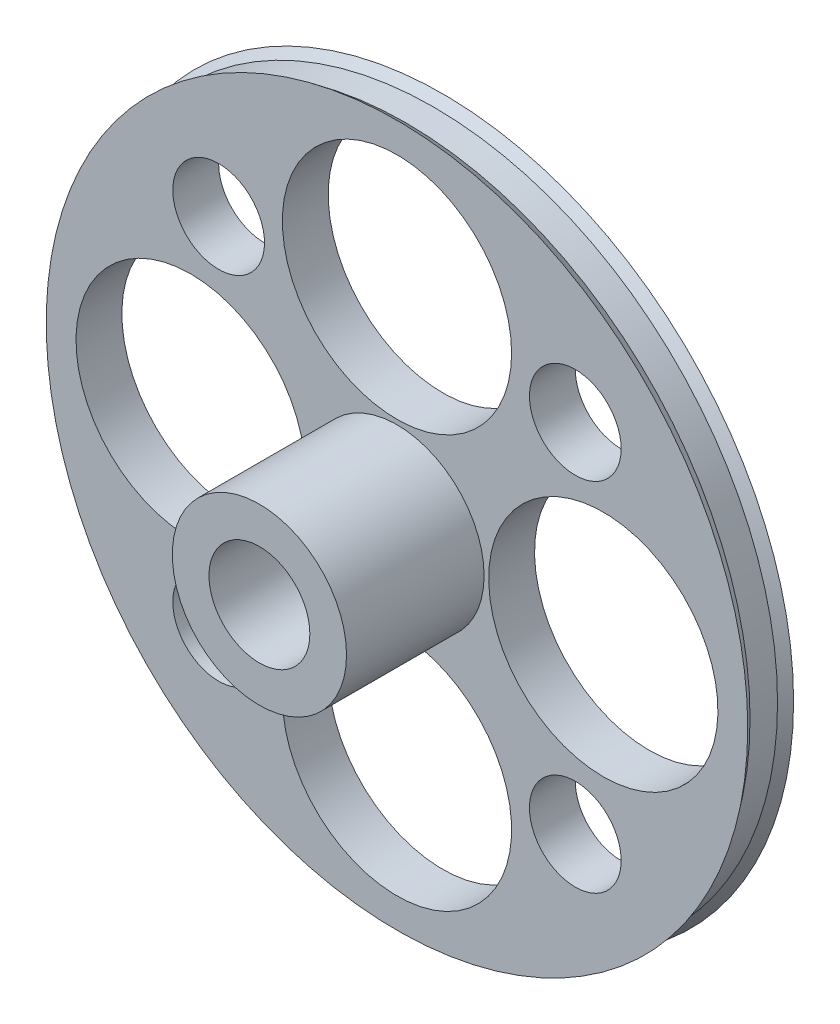
ISO-10303-21;
HEADER;
FILE_DESCRIPTION(('STEP AP214'),'2;1');
FILE_NAME('part.step','',(''),(''),'','','');
FILE_SCHEMA(('AUTOMOTIVE_DESIGN { 1 0 10303 214 1 1 1 1 }'));
ENDSEC;
DATA;
#1=APPLICATION_CONTEXT('core data for automotive mechanical design processes');
#2=APPLICATION_PROTOCOL_DEFINITION('international standard','automotive_design',2000,#1);
#3=PRODUCT_CONTEXT('',#1,'mechanical');
#4=PRODUCT('Part','Part','',(#3));
#5=PRODUCT_RELATED_PRODUCT_CATEGORY('part','',(#4));
#6=PRODUCT_DEFINITION_FORMATION('','',#4);
#7=PRODUCT_DEFINITION_CONTEXT('part definition',#1,'design');
#8=PRODUCT_DEFINITION('design','',#6,#7);
#9=PRODUCT_DEFINITION_SHAPE('','',#8);
#10=(LENGTH_UNIT() NAMED_UNIT(*) SI_UNIT(.MILLI.,.METRE.));
#11=(NAMED_UNIT(*) PLANE_ANGLE_UNIT() SI_UNIT($,.RADIAN.));
#12=(NAMED_UNIT(*) SI_UNIT($,.STERADIAN.) SOLID_ANGLE_UNIT());
#13=UNCERTAINTY_MEASURE_WITH_UNIT(LENGTH_MEASURE(1.E-05),#10,'distance_accuracy_value','');
#14=(GEOMETRIC_REPRESENTATION_CONTEXT(3) GLOBAL_UNCERTAINTY_ASSIGNED_CONTEXT((#13)) GLOBAL_UNIT_ASSIGNED_CONTEXT((#10,
#11,#12)) REPRESENTATION_CONTEXT('',''));
#15=CARTESIAN_POINT('',(0.,0.,0.));
#16=DIRECTION('',(0.,0.,1.));
#17=DIRECTION('',(1.,0.,0.));
#18=AXIS2_PLACEMENT_3D('',#15,#16,#17);
#19=CARTESIAN_POINT('',(0.,0.,10.));
#20=DIRECTION('',(0.,0.,1.));
#21=DIRECTION('',(1.,0.,0.));
#22=AXIS2_PLACEMENT_3D('',#19,#20,#21);
#23=PLANE('',#22);
#24=CARTESIAN_POINT('',(-38.8908729652596,38.8908729652606,10.));
#25=DIRECTION('',(0.,0.,1.));
#26=DIRECTION('',(0.,1.,0.));
#27=AXIS2_PLACEMENT_3D('',#24,#25,#26);
#28=CIRCLE('',#27,10.);
#29=CARTESIAN_POINT('',(-38.8908729652595,48.8908729652606,10.));
#30=VERTEX_POINT('',#29);
#31=EDGE_CURVE('E104',#30,#30,#28,.T.);
#32=ORIENTED_EDGE('',*,*,#31,.F.);
#33=EDGE_LOOP('',(#32));
#34=FACE_BOUND('',#33,.T.);
#35=CARTESIAN_POINT('',(-38.8908729652602,-38.8908729652601,10.));
#36=DIRECTION('',(0.,0.,1.));
#37=DIRECTION('',(-1.,0.,0.));
#38=AXIS2_PLACEMENT_3D('',#35,#36,#37);
#39=CIRCLE('',#38,10.);
#40=CARTESIAN_POINT('',(-48.8908729652602,-38.8908729652601,10.));
#41=VERTEX_POINT('',#40);
#42=EDGE_CURVE('E98',#41,#41,#39,.T.);
#43=ORIENTED_EDGE('',*,*,#42,.F.);
#44=EDGE_LOOP('',(#43));
#45=FACE_BOUND('',#44,.T.);
#46=CARTESIAN_POINT('',(38.8908729652599,-38.8908729652603,10.));
#47=DIRECTION('',(0.,0.,1.));
#48=DIRECTION('',(0.,-1.,0.));
#49=AXIS2_PLACEMENT_3D('',#46,#47,#48);
#50=CIRCLE('',#49,10.);
#51=CARTESIAN_POINT('',(38.8908729652599,-48.8908729652603,10.));
#52=VERTEX_POINT('',#51);
#53=EDGE_CURVE('E92',#52,#52,#50,.T.);
#54=ORIENTED_EDGE('',*,*,#53,.F.);
#55=EDGE_LOOP('',(#54));
#56=FACE_BOUND('',#55,.T.);
#57=CARTESIAN_POINT('',(38.8908729652602,38.8908729652601,10.));
#58=DIRECTION('',(0.,0.,1.));
#59=DIRECTION('',(1.,0.,0.));
#60=AXIS2_PLACEMENT_3D('',#57,#58,#59);
#61=CIRCLE('',#60,10.);
#62=CARTESIAN_POINT('',(48.8908729652602,38.8908729652601,10.));
#63=VERTEX_POINT('',#62);
#64=EDGE_CURVE('E86',#63,#63,#61,.T.);
#65=ORIENTED_EDGE('',*,*,#64,.F.);
#66=EDGE_LOOP('',(#65));
#67=FACE_BOUND('',#66,.T.);
#68=CARTESIAN_POINT('',(-45.,4.71349980743823E-13,10.));
#69=DIRECTION('',(0.,0.,1.));
#70=DIRECTION('',(0.,1.,0.));
#71=AXIS2_PLACEMENT_3D('',#68,#69,#70);
#72=CIRCLE('',#71,25.);
#73=CARTESIAN_POINT('',(-44.9999999999997,25.0000000000005,10.));
#74=VERTEX_POINT('',#73);
#75=EDGE_CURVE('E80',#74,#74,#72,.T.);
#76=ORIENTED_EDGE('',*,*,#75,.F.);
#77=EDGE_LOOP('',(#76));
#78=FACE_BOUND('',#77,.T.);
#79=CARTESIAN_POINT('',(0.,-45.,10.));
#80=DIRECTION('',(0.,0.,1.));
#81=DIRECTION('',(-1.,0.,0.));
#82=AXIS2_PLACEMENT_3D('',#79,#80,#81);
#83=CIRCLE('',#82,25.);
#84=CARTESIAN_POINT('',(-25.,-45.,10.));
#85=VERTEX_POINT('',#84);
#86=EDGE_CURVE('E74',#85,#85,#83,.T.);
#87=ORIENTED_EDGE('',*,*,#86,.F.);
#88=EDGE_LOOP('',(#87));
#89=FACE_BOUND('',#88,.T.);
#90=CARTESIAN_POINT('',(45.,-1.57116660247941E-13,10.));
#91=DIRECTION('',(0.,0.,1.));
#92=DIRECTION('',(0.,-1.,0.));
#93=AXIS2_PLACEMENT_3D('',#90,#91,#92);
#94=CIRCLE('',#93,25.);
#95=CARTESIAN_POINT('',(44.9999999999999,-25.0000000000002,10.));
#96=VERTEX_POINT('',#95);
#97=EDGE_CURVE('E68',#96,#96,#94,.T.);
#98=ORIENTED_EDGE('',*,*,#97,.F.);
#99=EDGE_LOOP('',(#98));
#100=FACE_BOUND('',#99,.T.);
#101=CARTESIAN_POINT('',(0.,45.,10.));
#102=DIRECTION('',(0.,0.,1.));
#103=DIRECTION('',(1.,0.,0.));
#104=AXIS2_PLACEMENT_3D('',#101,#102,#103);
#105=CIRCLE('',#104,25.);
#106=CARTESIAN_POINT('',(25.,45.,10.));
#107=VERTEX_POINT('',#106);
#108=EDGE_CURVE('E62',#107,#107,#105,.T.);
#109=ORIENTED_EDGE('',*,*,#108,.F.);
#110=EDGE_LOOP('',(#109));
#111=FACE_BOUND('',#110,.T.);
#112=CARTESIAN_POINT('',(0.,0.,10.));
#113=DIRECTION('',(0.,0.,1.));
#114=DIRECTION('',(1.,0.,0.));
#115=AXIS2_PLACEMENT_3D('',#112,#113,#114);
#116=CIRCLE('',#115,19.);
#117=CARTESIAN_POINT('',(19.,0.,10.));
#118=VERTEX_POINT('',#117);
#119=EDGE_CURVE('E35',#118,#118,#116,.T.);
#120=ORIENTED_EDGE('',*,*,#119,.F.);
#121=EDGE_LOOP('',(#120));
#122=FACE_BOUND('',#121,.T.);
#123=CARTESIAN_POINT('',(0.,0.,10.));
#124=DIRECTION('',(0.,0.,1.));
#125=DIRECTION('',(1.,0.,0.));
#126=AXIS2_PLACEMENT_3D('',#123,#124,#125);
#127=CIRCLE('',#126,76.5);
#128=CARTESIAN_POINT('',(76.5,0.,10.));
#129=VERTEX_POINT('',#128);
#130=EDGE_CURVE('E55',#129,#129,#127,.T.);
#131=ORIENTED_EDGE('',*,*,#130,.T.);
#132=EDGE_LOOP('',(#131));
#133=FACE_BOUND('',#132,.T.);
#134=ADVANCED_FACE('F31',(#34,#45,#56,#67,#78,#89,#100,#111,#122,#133),#23,.T.);
#135=CARTESIAN_POINT('',(0.,0.,10.));
#136=DIRECTION('',(0.,0.,-1.));
#137=DIRECTION('',(-1.,0.,0.));
#138=AXIS2_PLACEMENT_3D('',#135,#136,#137);
#139=CYLINDRICAL_SURFACE('',#138,75.);
#140=CARTESIAN_POINT('',(0.,0.,8.));
#141=DIRECTION('',(0.,0.,1.));
#142=DIRECTION('',(1.,0.,0.));
#143=AXIS2_PLACEMENT_3D('',#140,#141,#142);
#144=CIRCLE('',#143,75.);
#145=CARTESIAN_POINT('',(75.,0.,8.));
#146=VERTEX_POINT('',#145);
#147=EDGE_CURVE('E58',#146,#146,#144,.T.);
#148=ORIENTED_EDGE('',*,*,#147,.F.);
#149=EDGE_LOOP('',(#148));
#150=FACE_BOUND('',#149,.T.);
#151=CARTESIAN_POINT('',(0.,0.,2.));
#152=DIRECTION('',(0.,0.,1.));
#153=DIRECTION('',(1.,0.,0.));
#154=AXIS2_PLACEMENT_3D('',#151,#152,#153);
#155=CIRCLE('',#154,75.);
#156=CARTESIAN_POINT('',(75.,0.,2.));
#157=VERTEX_POINT('',#156);
#158=EDGE_CURVE('E52',#157,#157,#155,.T.);
#159=ORIENTED_EDGE('',*,*,#158,.T.);
#160=EDGE_LOOP('',(#159));
#161=FACE_BOUND('',#160,.T.);
#162=ADVANCED_FACE('F33',(#150,#161),#139,.T.);
#163=CARTESIAN_POINT('',(0.,0.,0.));
#164=DIRECTION('',(0.,0.,1.));
#165=DIRECTION('',(1.,0.,0.));
#166=AXIS2_PLACEMENT_3D('',#163,#164,#165);
#167=PLANE('',#166);
#168=CARTESIAN_POINT('',(-38.8908729652596,38.8908729652606,0.));
#169=DIRECTION('',(0.,0.,1.));
#170=DIRECTION('',(0.,1.,0.));
#171=AXIS2_PLACEMENT_3D('',#168,#169,#170);
#172=CIRCLE('',#171,10.);
#173=CARTESIAN_POINT('',(-38.8908729652595,48.8908729652606,0.));
#174=VERTEX_POINT('',#173);
#175=EDGE_CURVE('E101',#174,#174,#172,.T.);
#176=ORIENTED_EDGE('',*,*,#175,.T.);
#177=EDGE_LOOP('',(#176));
#178=FACE_BOUND('',#177,.T.);
#179=CARTESIAN_POINT('',(-38.8908729652602,-38.8908729652601,0.));
#180=DIRECTION('',(0.,0.,1.));
#181=DIRECTION('',(-1.,0.,0.));
#182=AXIS2_PLACEMENT_3D('',#179,#180,#181);
#183=CIRCLE('',#182,10.);
#184=CARTESIAN_POINT('',(-48.8908729652602,-38.8908729652601,0.));
#185=VERTEX_POINT('',#184);
#186=EDGE_CURVE('E95',#185,#185,#183,.T.);
#187=ORIENTED_EDGE('',*,*,#186,.T.);
#188=EDGE_LOOP('',(#187));
#189=FACE_BOUND('',#188,.T.);
#190=CARTESIAN_POINT('',(38.8908729652599,-38.8908729652603,0.));
#191=DIRECTION('',(0.,0.,1.));
#192=DIRECTION('',(0.,-1.,0.));
#193=AXIS2_PLACEMENT_3D('',#190,#191,#192);
#194=CIRCLE('',#193,10.);
#195=CARTESIAN_POINT('',(38.8908729652599,-48.8908729652603,0.));
#196=VERTEX_POINT('',#195);
#197=EDGE_CURVE('E89',#196,#196,#194,.T.);
#198=ORIENTED_EDGE('',*,*,#197,.T.);
#199=EDGE_LOOP('',(#198));
#200=FACE_BOUND('',#199,.T.);
#201=CARTESIAN_POINT('',(38.8908729652602,38.8908729652601,0.));
#202=DIRECTION('',(0.,0.,1.));
#203=DIRECTION('',(1.,0.,0.));
#204=AXIS2_PLACEMENT_3D('',#201,#202,#203);
#205=CIRCLE('',#204,10.);
#206=CARTESIAN_POINT('',(48.8908729652602,38.8908729652601,0.));
#207=VERTEX_POINT('',#206);
#208=EDGE_CURVE('E83',#207,#207,#205,.T.);
#209=ORIENTED_EDGE('',*,*,#208,.T.);
#210=EDGE_LOOP('',(#209));
#211=FACE_BOUND('',#210,.T.);
#212=CARTESIAN_POINT('',(-45.,4.71349980743823E-13,0.));
#213=DIRECTION('',(0.,0.,1.));
#214=DIRECTION('',(0.,1.,0.));
#215=AXIS2_PLACEMENT_3D('',#212,#213,#214);
#216=CIRCLE('',#215,25.);
#217=CARTESIAN_POINT('',(-44.9999999999997,25.0000000000005,0.));
#218=VERTEX_POINT('',#217);
#219=EDGE_CURVE('E77',#218,#218,#216,.T.);
#220=ORIENTED_EDGE('',*,*,#219,.T.);
#221=EDGE_LOOP('',(#220));
#222=FACE_BOUND('',#221,.T.);
#223=CARTESIAN_POINT('',(0.,-45.,0.));
#224=DIRECTION('',(0.,0.,1.));
#225=DIRECTION('',(-1.,0.,0.));
#226=AXIS2_PLACEMENT_3D('',#223,#224,#225);
#227=CIRCLE('',#226,25.);
#228=CARTESIAN_POINT('',(-25.,-45.,0.));
#229=VERTEX_POINT('',#228);
#230=EDGE_CURVE('E71',#229,#229,#227,.T.);
#231=ORIENTED_EDGE('',*,*,#230,.T.);
#232=EDGE_LOOP('',(#231));
#233=FACE_BOUND('',#232,.T.);
#234=CARTESIAN_POINT('',(45.,-1.57116660247941E-13,0.));
#235=DIRECTION('',(0.,0.,1.));
#236=DIRECTION('',(0.,-1.,0.));
#237=AXIS2_PLACEMENT_3D('',#234,#235,#236);
#238=CIRCLE('',#237,25.);
#239=CARTESIAN_POINT('',(44.9999999999999,-25.0000000000002,0.));
#240=VERTEX_POINT('',#239);
#241=EDGE_CURVE('E65',#240,#240,#238,.T.);
#242=ORIENTED_EDGE('',*,*,#241,.T.);
#243=EDGE_LOOP('',(#242));
#244=FACE_BOUND('',#243,.T.);
#245=CARTESIAN_POINT('',(0.,45.,0.));
#246=DIRECTION('',(0.,0.,1.));
#247=DIRECTION('',(1.,0.,0.));
#248=AXIS2_PLACEMENT_3D('',#245,#246,#247);
#249=CIRCLE('',#248,25.);
#250=CARTESIAN_POINT('',(25.,45.,0.));
#251=VERTEX_POINT('',#250);
#252=EDGE_CURVE('E61',#251,#251,#249,.T.);
#253=ORIENTED_EDGE('',*,*,#252,.T.);
#254=EDGE_LOOP('',(#253));
#255=FACE_BOUND('',#254,.T.);
#256=CARTESIAN_POINT('',(0.,0.,0.));
#257=DIRECTION('',(0.,0.,1.));
#258=DIRECTION('',(1.,0.,0.));
#259=AXIS2_PLACEMENT_3D('',#256,#257,#258);
#260=CIRCLE('',#259,11.);
#261=CARTESIAN_POINT('',(11.,0.,0.));
#262=VERTEX_POINT('',#261);
#263=EDGE_CURVE('E42',#262,#262,#260,.T.);
#264=ORIENTED_EDGE('',*,*,#263,.T.);
#265=EDGE_LOOP('',(#264));
#266=FACE_BOUND('',#265,.T.);
#267=CARTESIAN_POINT('',(0.,0.,0.));
#268=DIRECTION('',(0.,0.,1.));
#269=DIRECTION('',(1.,0.,0.));
#270=AXIS2_PLACEMENT_3D('',#267,#268,#269);
#271=CIRCLE('',#270,76.5);
#272=CARTESIAN_POINT('',(76.5,0.,0.));
#273=VERTEX_POINT('',#272);
#274=EDGE_CURVE('E47',#273,#273,#271,.T.);
#275=ORIENTED_EDGE('',*,*,#274,.F.);
#276=EDGE_LOOP('',(#275));
#277=FACE_BOUND('',#276,.T.);
#278=ADVANCED_FACE('F110',(#178,#189,#200,#211,#222,#233,#244,#255,#266,#277),#167,.F.);
#279=CARTESIAN_POINT('',(0.,0.,40.));
#280=DIRECTION('',(0.,0.,-1.));
#281=DIRECTION('',(-1.,0.,0.));
#282=AXIS2_PLACEMENT_3D('',#279,#280,#281);
#283=CYLINDRICAL_SURFACE('',#282,19.);
#284=CARTESIAN_POINT('',(0.,0.,40.));
#285=DIRECTION('',(0.,0.,1.));
#286=DIRECTION('',(1.,0.,0.));
#287=AXIS2_PLACEMENT_3D('',#284,#285,#286);
#288=CIRCLE('',#287,19.);
#289=CARTESIAN_POINT('',(19.,0.,40.));
#290=VERTEX_POINT('',#289);
#291=EDGE_CURVE('E10',#290,#290,#288,.T.);
#292=ORIENTED_EDGE('',*,*,#291,.F.);
#293=EDGE_LOOP('',(#292));
#294=FACE_BOUND('',#293,.T.);
#295=ORIENTED_EDGE('',*,*,#119,.T.);
#296=EDGE_LOOP('',(#295));
#297=FACE_BOUND('',#296,.T.);
#298=ADVANCED_FACE('F165',(#294,#297),#283,.T.);
#299=CARTESIAN_POINT('',(0.,0.,40.));
#300=DIRECTION('',(0.,0.,1.));
#301=DIRECTION('',(1.,0.,0.));
#302=AXIS2_PLACEMENT_3D('',#299,#300,#301);
#303=PLANE('',#302);
#304=CARTESIAN_POINT('',(0.,0.,40.));
#305=DIRECTION('',(0.,0.,1.));
#306=DIRECTION('',(1.,0.,0.));
#307=AXIS2_PLACEMENT_3D('',#304,#305,#306);
#308=CIRCLE('',#307,11.);
#309=CARTESIAN_POINT('',(11.,0.,40.));
#310=VERTEX_POINT('',#309);
#311=EDGE_CURVE('E44',#310,#310,#308,.T.);
#312=ORIENTED_EDGE('',*,*,#311,.F.);
#313=EDGE_LOOP('',(#312));
#314=FACE_BOUND('',#313,.T.);
#315=ORIENTED_EDGE('',*,*,#291,.T.);
#316=EDGE_LOOP('',(#315));
#317=FACE_BOUND('',#316,.T.);
#318=ADVANCED_FACE('F161',(#314,#317),#303,.T.);
#319=CARTESIAN_POINT('',(0.,0.,0.));
#320=DIRECTION('',(0.,0.,1.));
#321=DIRECTION('',(1.,0.,0.));
#322=AXIS2_PLACEMENT_3D('',#319,#320,#321);
#323=CYLINDRICAL_SURFACE('',#322,11.);
#324=ORIENTED_EDGE('',*,*,#263,.F.);
#325=EDGE_LOOP('',(#324));
#326=FACE_BOUND('',#325,.T.);
#327=ORIENTED_EDGE('',*,*,#311,.T.);
#328=EDGE_LOOP('',(#327));
#329=FACE_BOUND('',#328,.T.);
#330=ADVANCED_FACE('F154',(#326,#329),#323,.F.);
#331=CARTESIAN_POINT('',(0.,0.,2.));
#332=DIRECTION('',(0.,0.,-1.));
#333=DIRECTION('',(-1.,0.,0.));
#334=AXIS2_PLACEMENT_3D('',#331,#332,#333);
#335=CONICAL_SURFACE('',#334,75.,0.643501108793284);
#336=ORIENTED_EDGE('',*,*,#274,.T.);
#337=EDGE_LOOP('',(#336));
#338=FACE_BOUND('',#337,.T.);
#339=ORIENTED_EDGE('',*,*,#158,.F.);
#340=EDGE_LOOP('',(#339));
#341=FACE_BOUND('',#340,.T.);
#342=ADVANCED_FACE('F144',(#338,#341),#335,.T.);
#343=CARTESIAN_POINT('',(0.,0.,10.));
#344=DIRECTION('',(0.,0.,1.));
#345=DIRECTION('',(1.,0.,0.));
#346=AXIS2_PLACEMENT_3D('',#343,#344,#345);
#347=CONICAL_SURFACE('',#346,76.5,0.643501108793284);
#348=ORIENTED_EDGE('',*,*,#147,.T.);
#349=EDGE_LOOP('',(#348));
#350=FACE_BOUND('',#349,.T.);
#351=ORIENTED_EDGE('',*,*,#130,.F.);
#352=EDGE_LOOP('',(#351));
#353=FACE_BOUND('',#352,.T.);
#354=ADVANCED_FACE('F141',(#350,#353),#347,.T.);
#355=CARTESIAN_POINT('',(0.,45.,0.));
#356=DIRECTION('',(0.,0.,1.));
#357=DIRECTION('',(1.,0.,0.));
#358=AXIS2_PLACEMENT_3D('',#355,#356,#357);
#359=CYLINDRICAL_SURFACE('',#358,25.);
#360=ORIENTED_EDGE('',*,*,#252,.F.);
#361=EDGE_LOOP('',(#360));
#362=FACE_BOUND('',#361,.T.);
#363=ORIENTED_EDGE('',*,*,#108,.T.);
#364=EDGE_LOOP('',(#363));
#365=FACE_BOUND('',#364,.T.);
#366=ADVANCED_FACE('F143',(#362,#365),#359,.F.);
#367=CARTESIAN_POINT('',(45.,-1.57116660247941E-13,0.));
#368=DIRECTION('',(0.,0.,1.));
#369=DIRECTION('',(1.,0.,0.));
#370=AXIS2_PLACEMENT_3D('',#367,#368,#369);
#371=CYLINDRICAL_SURFACE('',#370,25.);
#372=ORIENTED_EDGE('',*,*,#241,.F.);
#373=EDGE_LOOP('',(#372));
#374=FACE_BOUND('',#373,.T.);
#375=ORIENTED_EDGE('',*,*,#97,.T.);
#376=EDGE_LOOP('',(#375));
#377=FACE_BOUND('',#376,.T.);
#378=ADVANCED_FACE('F151',(#374,#377),#371,.F.);
#379=CARTESIAN_POINT('',(0.,-45.,0.));
#380=DIRECTION('',(0.,0.,1.));
#381=DIRECTION('',(1.,0.,0.));
#382=AXIS2_PLACEMENT_3D('',#379,#380,#381);
#383=CYLINDRICAL_SURFACE('',#382,25.);
#384=ORIENTED_EDGE('',*,*,#230,.F.);
#385=EDGE_LOOP('',(#384));
#386=FACE_BOUND('',#385,.T.);
#387=ORIENTED_EDGE('',*,*,#86,.T.);
#388=EDGE_LOOP('',(#387));
#389=FACE_BOUND('',#388,.T.);
#390=ADVANCED_FACE('F237',(#386,#389),#383,.F.);
#391=CARTESIAN_POINT('',(-45.,4.71349980743823E-13,0.));
#392=DIRECTION('',(0.,0.,1.));
#393=DIRECTION('',(1.,0.,0.));
#394=AXIS2_PLACEMENT_3D('',#391,#392,#393);
#395=CYLINDRICAL_SURFACE('',#394,25.);
#396=ORIENTED_EDGE('',*,*,#219,.F.);
#397=EDGE_LOOP('',(#396));
#398=FACE_BOUND('',#397,.T.);
#399=ORIENTED_EDGE('',*,*,#75,.T.);
#400=EDGE_LOOP('',(#399));
#401=FACE_BOUND('',#400,.T.);
#402=ADVANCED_FACE('F233',(#398,#401),#395,.F.);
#403=CARTESIAN_POINT('',(38.8908729652602,38.8908729652601,0.));
#404=DIRECTION('',(0.,0.,1.));
#405=DIRECTION('',(1.,0.,0.));
#406=AXIS2_PLACEMENT_3D('',#403,#404,#405);
#407=CYLINDRICAL_SURFACE('',#406,10.);
#408=ORIENTED_EDGE('',*,*,#208,.F.);
#409=EDGE_LOOP('',(#408));
#410=FACE_BOUND('',#409,.T.);
#411=ORIENTED_EDGE('',*,*,#64,.T.);
#412=EDGE_LOOP('',(#411));
#413=FACE_BOUND('',#412,.T.);
#414=ADVANCED_FACE('F194',(#410,#413),#407,.F.);
#415=CARTESIAN_POINT('',(38.8908729652599,-38.8908729652603,0.));
#416=DIRECTION('',(0.,0.,1.));
#417=DIRECTION('',(1.,0.,0.));
#418=AXIS2_PLACEMENT_3D('',#415,#416,#417);
#419=CYLINDRICAL_SURFACE('',#418,10.);
#420=ORIENTED_EDGE('',*,*,#197,.F.);
#421=EDGE_LOOP('',(#420));
#422=FACE_BOUND('',#421,.T.);
#423=ORIENTED_EDGE('',*,*,#53,.T.);
#424=EDGE_LOOP('',(#423));
#425=FACE_BOUND('',#424,.T.);
#426=ADVANCED_FACE('F205',(#422,#425),#419,.F.);
#427=CARTESIAN_POINT('',(-38.8908729652602,-38.8908729652601,0.));
#428=DIRECTION('',(0.,0.,1.));
#429=DIRECTION('',(1.,0.,0.));
#430=AXIS2_PLACEMENT_3D('',#427,#428,#429);
#431=CYLINDRICAL_SURFACE('',#430,10.);
#432=ORIENTED_EDGE('',*,*,#186,.F.);
#433=EDGE_LOOP('',(#432));
#434=FACE_BOUND('',#433,.T.);
#435=ORIENTED_EDGE('',*,*,#42,.T.);
#436=EDGE_LOOP('',(#435));
#437=FACE_BOUND('',#436,.T.);
#438=ADVANCED_FACE('F116',(#434,#437),#431,.F.);
#439=CARTESIAN_POINT('',(-38.8908729652596,38.8908729652606,0.));
#440=DIRECTION('',(0.,0.,1.));
#441=DIRECTION('',(1.,0.,0.));
#442=AXIS2_PLACEMENT_3D('',#439,#440,#441);
#443=CYLINDRICAL_SURFACE('',#442,10.);
#444=ORIENTED_EDGE('',*,*,#175,.F.);
#445=EDGE_LOOP('',(#444));
#446=FACE_BOUND('',#445,.T.);
#447=ORIENTED_EDGE('',*,*,#31,.T.);
#448=EDGE_LOOP('',(#447));
#449=FACE_BOUND('',#448,.T.);
#450=ADVANCED_FACE('F113',(#446,#449),#443,.F.);
#451=CLOSED_SHELL('',(#134,#162,#278,#298,#318,#330,#342,#354,#366,#378,#390,#402,#414,#426,
#438,#450));
#452=MANIFOLD_SOLID_BREP('B2',#451);
#453=ADVANCED_BREP_SHAPE_REPRESENTATION('',(#18,#452),#14);
#454=SHAPE_DEFINITION_REPRESENTATION(#9,#453);
ENDSEC;
END-ISO-10303-21;
